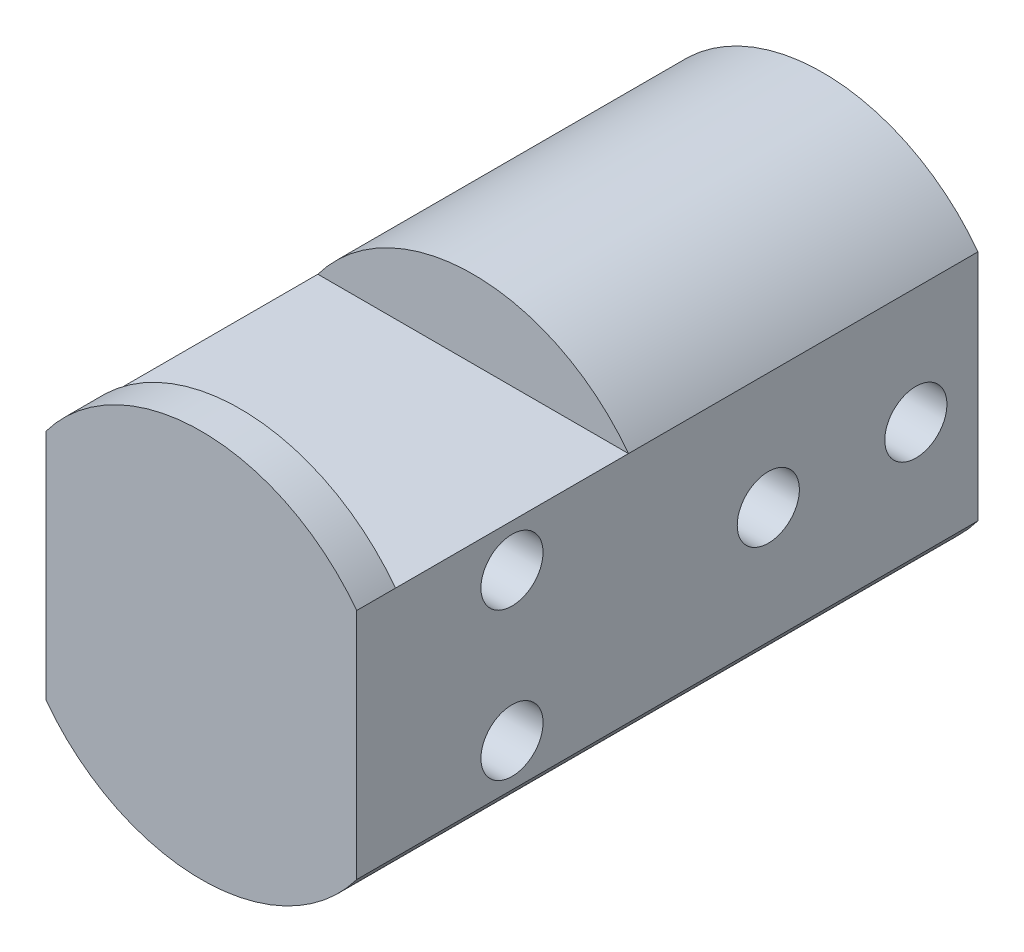
ISO-10303-21;
HEADER;
FILE_DESCRIPTION(('STEP AP214'),'2;1');
FILE_NAME('part.step','',(''),(''),'','','');
FILE_SCHEMA(('AUTOMOTIVE_DESIGN { 1 0 10303 214 1 1 1 1 }'));
ENDSEC;
DATA;
#1=APPLICATION_CONTEXT('core data for automotive mechanical design processes');
#2=APPLICATION_PROTOCOL_DEFINITION('international standard','automotive_design',2000,#1);
#3=PRODUCT_CONTEXT('',#1,'mechanical');
#4=PRODUCT('Part','Part','',(#3));
#5=PRODUCT_RELATED_PRODUCT_CATEGORY('part','',(#4));
#6=PRODUCT_DEFINITION_FORMATION('','',#4);
#7=PRODUCT_DEFINITION_CONTEXT('part definition',#1,'design');
#8=PRODUCT_DEFINITION('design','',#6,#7);
#9=PRODUCT_DEFINITION_SHAPE('','',#8);
#10=(LENGTH_UNIT() NAMED_UNIT(*) SI_UNIT(.MILLI.,.METRE.));
#11=(NAMED_UNIT(*) PLANE_ANGLE_UNIT() SI_UNIT($,.RADIAN.));
#12=(NAMED_UNIT(*) SI_UNIT($,.STERADIAN.) SOLID_ANGLE_UNIT());
#13=UNCERTAINTY_MEASURE_WITH_UNIT(LENGTH_MEASURE(1.E-05),#10,'distance_accuracy_value','');
#14=(GEOMETRIC_REPRESENTATION_CONTEXT(3) GLOBAL_UNCERTAINTY_ASSIGNED_CONTEXT((#13)) GLOBAL_UNIT_ASSIGNED_CONTEXT((#10,
#11,#12)) REPRESENTATION_CONTEXT('',''));
#15=CARTESIAN_POINT('',(0.,0.,0.));
#16=DIRECTION('',(0.,0.,1.));
#17=DIRECTION('',(1.,0.,0.));
#18=AXIS2_PLACEMENT_3D('',#15,#16,#17);
#19=CARTESIAN_POINT('',(-20.,15.,45.));
#20=DIRECTION('',(0.,-1.,0.));
#21=DIRECTION('',(0.,0.,-1.));
#22=AXIS2_PLACEMENT_3D('',#19,#20,#21);
#23=PLANE('',#22);
#24=DIRECTION('',(1.,0.,0.));
#25=VECTOR('',#24,1.);
#26=CARTESIAN_POINT('',(-20.,15.,75.));
#27=LINE('',#26,#25);
#28=CARTESIAN_POINT('',(-20.,15.,75.));
#29=VERTEX_POINT('',#28);
#30=CARTESIAN_POINT('',(20.,15.,75.));
#31=VERTEX_POINT('',#30);
#32=EDGE_CURVE('E57',#29,#31,#27,.T.);
#33=ORIENTED_EDGE('',*,*,#32,.T.);
#34=DIRECTION('',(0.,0.,-1.));
#35=VECTOR('',#34,1.);
#36=CARTESIAN_POINT('',(20.,15.,80.));
#37=LINE('',#36,#35);
#38=CARTESIAN_POINT('',(20.,15.,45.));
#39=VERTEX_POINT('',#38);
#40=EDGE_CURVE('E154',#31,#39,#37,.T.);
#41=ORIENTED_EDGE('',*,*,#40,.T.);
#42=DIRECTION('',(1.,0.,0.));
#43=VECTOR('',#42,1.);
#44=CARTESIAN_POINT('',(-20.,15.,45.));
#45=LINE('',#44,#43);
#46=CARTESIAN_POINT('',(-20.,15.,45.));
#47=VERTEX_POINT('',#46);
#48=EDGE_CURVE('E172',#47,#39,#45,.T.);
#49=ORIENTED_EDGE('',*,*,#48,.F.);
#50=DIRECTION('',(0.,0.,-1.));
#51=VECTOR('',#50,1.);
#52=CARTESIAN_POINT('',(-20.,15.,80.));
#53=LINE('',#52,#51);
#54=EDGE_CURVE('E52',#29,#47,#53,.T.);
#55=ORIENTED_EDGE('',*,*,#54,.F.);
#56=EDGE_LOOP('',(#33,#41,#49,#55));
#57=FACE_BOUND('',#56,.T.);
#58=ADVANCED_FACE('F37',(#57),#23,.F.);
#59=CARTESIAN_POINT('',(0.,0.,80.));
#60=DIRECTION('',(0.,0.,-1.));
#61=DIRECTION('',(-1.,0.,0.));
#62=AXIS2_PLACEMENT_3D('',#59,#60,#61);
#63=CYLINDRICAL_SURFACE('',#62,25.);
#64=CARTESIAN_POINT('',(0.,0.,45.));
#65=DIRECTION('',(0.,0.,1.));
#66=DIRECTION('',(1.,0.,0.));
#67=AXIS2_PLACEMENT_3D('',#64,#65,#66);
#68=CIRCLE('',#67,25.);
#69=EDGE_CURVE('E169',#39,#47,#68,.T.);
#70=ORIENTED_EDGE('',*,*,#69,.F.);
#71=CARTESIAN_POINT('',(20.,15.,0.));
#72=VERTEX_POINT('',#71);
#73=EDGE_CURVE('E160',#39,#72,#37,.T.);
#74=ORIENTED_EDGE('',*,*,#73,.T.);
#75=CARTESIAN_POINT('',(0.,0.,0.));
#76=DIRECTION('',(0.,0.,1.));
#77=DIRECTION('',(1.,0.,0.));
#78=AXIS2_PLACEMENT_3D('',#75,#76,#77);
#79=CIRCLE('',#78,25.);
#80=CARTESIAN_POINT('',(-20.,15.,0.));
#81=VERTEX_POINT('',#80);
#82=EDGE_CURVE('E237',#72,#81,#79,.T.);
#83=ORIENTED_EDGE('',*,*,#82,.T.);
#84=EDGE_CURVE('E246',#47,#81,#53,.T.);
#85=ORIENTED_EDGE('',*,*,#84,.F.);
#86=EDGE_LOOP('',(#70,#74,#83,#85));
#87=FACE_BOUND('',#86,.T.);
#88=ADVANCED_FACE('F335',(#87),#63,.T.);
#89=CARTESIAN_POINT('',(20.,0.,80.));
#90=DIRECTION('',(1.,0.,0.));
#91=DIRECTION('',(0.,0.,-1.));
#92=AXIS2_PLACEMENT_3D('',#89,#90,#91);
#93=PLANE('',#92);
#94=CARTESIAN_POINT('',(20.,-9.5,60.));
#95=DIRECTION('',(-1.,0.,0.));
#96=DIRECTION('',(0.,0.,1.));
#97=AXIS2_PLACEMENT_3D('',#94,#95,#96);
#98=CIRCLE('',#97,4.00000000000001);
#99=CARTESIAN_POINT('',(20.,-9.5,64.));
#100=VERTEX_POINT('',#99);
#101=EDGE_CURVE('E176',#100,#100,#98,.T.);
#102=ORIENTED_EDGE('',*,*,#101,.T.);
#103=EDGE_LOOP('',(#102));
#104=FACE_BOUND('',#103,.T.);
#105=CARTESIAN_POINT('',(20.,9.5,60.));
#106=DIRECTION('',(-1.,0.,0.));
#107=DIRECTION('',(0.,0.,1.));
#108=AXIS2_PLACEMENT_3D('',#105,#106,#107);
#109=CIRCLE('',#108,4.00000000000001);
#110=CARTESIAN_POINT('',(20.,9.5,64.));
#111=VERTEX_POINT('',#110);
#112=EDGE_CURVE('E182',#111,#111,#109,.T.);
#113=ORIENTED_EDGE('',*,*,#112,.T.);
#114=EDGE_LOOP('',(#113));
#115=FACE_BOUND('',#114,.T.);
#116=CARTESIAN_POINT('',(20.,0.,27.));
#117=DIRECTION('',(-1.,0.,0.));
#118=DIRECTION('',(0.,0.,1.));
#119=AXIS2_PLACEMENT_3D('',#116,#117,#118);
#120=CIRCLE('',#119,4.);
#121=CARTESIAN_POINT('',(20.,0.,31.));
#122=VERTEX_POINT('',#121);
#123=EDGE_CURVE('E188',#122,#122,#120,.T.);
#124=ORIENTED_EDGE('',*,*,#123,.T.);
#125=EDGE_LOOP('',(#124));
#126=FACE_BOUND('',#125,.T.);
#127=CARTESIAN_POINT('',(20.,0.,8.));
#128=DIRECTION('',(-1.,0.,0.));
#129=DIRECTION('',(0.,0.,1.));
#130=AXIS2_PLACEMENT_3D('',#127,#128,#129);
#131=CIRCLE('',#130,4.);
#132=CARTESIAN_POINT('',(20.,0.,12.));
#133=VERTEX_POINT('',#132);
#134=EDGE_CURVE('E198',#133,#133,#131,.T.);
#135=ORIENTED_EDGE('',*,*,#134,.T.);
#136=EDGE_LOOP('',(#135));
#137=FACE_BOUND('',#136,.T.);
#138=DIRECTION('',(0.,-1.,0.));
#139=VECTOR('',#138,1.);
#140=CARTESIAN_POINT('',(20.,0.,0.));
#141=LINE('',#140,#139);
#142=CARTESIAN_POINT('',(20.,-15.,0.));
#143=VERTEX_POINT('',#142);
#144=EDGE_CURVE('E221',#72,#143,#141,.T.);
#145=ORIENTED_EDGE('',*,*,#144,.F.);
#146=ORIENTED_EDGE('',*,*,#73,.F.);
#147=ORIENTED_EDGE('',*,*,#40,.F.);
#148=CARTESIAN_POINT('',(20.,15.,80.));
#149=VERTEX_POINT('',#148);
#150=EDGE_CURVE('E150',#149,#31,#37,.T.);
#151=ORIENTED_EDGE('',*,*,#150,.F.);
#152=DIRECTION('',(0.,-1.,0.));
#153=VECTOR('',#152,1.);
#154=CARTESIAN_POINT('',(20.,0.,80.));
#155=LINE('',#154,#153);
#156=CARTESIAN_POINT('',(20.,-15.,80.));
#157=VERTEX_POINT('',#156);
#158=EDGE_CURVE('E136',#149,#157,#155,.T.);
#159=ORIENTED_EDGE('',*,*,#158,.T.);
#160=DIRECTION('',(0.,0.,-1.));
#161=VECTOR('',#160,1.);
#162=CARTESIAN_POINT('',(20.,-15.,80.));
#163=LINE('',#162,#161);
#164=EDGE_CURVE('E233',#157,#143,#163,.T.);
#165=ORIENTED_EDGE('',*,*,#164,.T.);
#166=EDGE_LOOP('',(#145,#146,#147,#151,#159,#165));
#167=FACE_BOUND('',#166,.T.);
#168=ADVANCED_FACE('F152',(#104,#115,#126,#137,#167),#93,.T.);
#169=CARTESIAN_POINT('',(-20.,0.,80.));
#170=DIRECTION('',(-1.,0.,0.));
#171=DIRECTION('',(0.,0.,1.));
#172=AXIS2_PLACEMENT_3D('',#169,#170,#171);
#173=PLANE('',#172);
#174=CARTESIAN_POINT('',(-20.,-9.5,60.));
#175=DIRECTION('',(-1.,0.,0.));
#176=DIRECTION('',(0.,0.,1.));
#177=AXIS2_PLACEMENT_3D('',#174,#175,#176);
#178=CIRCLE('',#177,4.00000000000001);
#179=CARTESIAN_POINT('',(-20.,-9.5,64.));
#180=VERTEX_POINT('',#179);
#181=EDGE_CURVE('E175',#180,#180,#178,.T.);
#182=ORIENTED_EDGE('',*,*,#181,.F.);
#183=EDGE_LOOP('',(#182));
#184=FACE_BOUND('',#183,.T.);
#185=CARTESIAN_POINT('',(-20.,9.5,60.));
#186=DIRECTION('',(-1.,0.,0.));
#187=DIRECTION('',(0.,0.,1.));
#188=AXIS2_PLACEMENT_3D('',#185,#186,#187);
#189=CIRCLE('',#188,4.00000000000001);
#190=CARTESIAN_POINT('',(-20.,9.5,64.));
#191=VERTEX_POINT('',#190);
#192=EDGE_CURVE('E179',#191,#191,#189,.T.);
#193=ORIENTED_EDGE('',*,*,#192,.F.);
#194=EDGE_LOOP('',(#193));
#195=FACE_BOUND('',#194,.T.);
#196=CARTESIAN_POINT('',(-20.,0.,27.));
#197=DIRECTION('',(-1.,0.,0.));
#198=DIRECTION('',(0.,0.,1.));
#199=AXIS2_PLACEMENT_3D('',#196,#197,#198);
#200=CIRCLE('',#199,4.);
#201=CARTESIAN_POINT('',(-20.,0.,31.));
#202=VERTEX_POINT('',#201);
#203=EDGE_CURVE('E185',#202,#202,#200,.T.);
#204=ORIENTED_EDGE('',*,*,#203,.F.);
#205=EDGE_LOOP('',(#204));
#206=FACE_BOUND('',#205,.T.);
#207=CARTESIAN_POINT('',(-20.,0.,8.));
#208=DIRECTION('',(-1.,0.,0.));
#209=DIRECTION('',(0.,0.,1.));
#210=AXIS2_PLACEMENT_3D('',#207,#208,#209);
#211=CIRCLE('',#210,4.);
#212=CARTESIAN_POINT('',(-20.,0.,12.));
#213=VERTEX_POINT('',#212);
#214=EDGE_CURVE('E197',#213,#213,#211,.T.);
#215=ORIENTED_EDGE('',*,*,#214,.F.);
#216=EDGE_LOOP('',(#215));
#217=FACE_BOUND('',#216,.T.);
#218=DIRECTION('',(0.,1.,0.));
#219=VECTOR('',#218,1.);
#220=CARTESIAN_POINT('',(-20.,0.,0.));
#221=LINE('',#220,#219);
#222=CARTESIAN_POINT('',(-20.,-15.,0.));
#223=VERTEX_POINT('',#222);
#224=EDGE_CURVE('E240',#223,#81,#221,.T.);
#225=ORIENTED_EDGE('',*,*,#224,.F.);
#226=DIRECTION('',(0.,0.,-1.));
#227=VECTOR('',#226,1.);
#228=CARTESIAN_POINT('',(-20.,-15.,80.));
#229=LINE('',#228,#227);
#230=CARTESIAN_POINT('',(-20.,-15.,80.));
#231=VERTEX_POINT('',#230);
#232=EDGE_CURVE('E244',#231,#223,#229,.T.);
#233=ORIENTED_EDGE('',*,*,#232,.F.);
#234=DIRECTION('',(0.,1.,0.));
#235=VECTOR('',#234,1.);
#236=CARTESIAN_POINT('',(-20.,0.,80.));
#237=LINE('',#236,#235);
#238=CARTESIAN_POINT('',(-20.,15.,80.));
#239=VERTEX_POINT('',#238);
#240=EDGE_CURVE('E146',#231,#239,#237,.T.);
#241=ORIENTED_EDGE('',*,*,#240,.T.);
#242=EDGE_CURVE('E163',#239,#29,#53,.T.);
#243=ORIENTED_EDGE('',*,*,#242,.T.);
#244=ORIENTED_EDGE('',*,*,#54,.T.);
#245=ORIENTED_EDGE('',*,*,#84,.T.);
#246=EDGE_LOOP('',(#225,#233,#241,#243,#244,#245));
#247=FACE_BOUND('',#246,.T.);
#248=ADVANCED_FACE('F379',(#184,#195,#206,#217,#247),#173,.T.);
#249=EDGE_CURVE('E147',#223,#143,#79,.T.);
#250=ORIENTED_EDGE('',*,*,#249,.T.);
#251=ORIENTED_EDGE('',*,*,#164,.F.);
#252=CARTESIAN_POINT('',(0.,0.,80.));
#253=DIRECTION('',(0.,0.,1.));
#254=DIRECTION('',(1.,0.,0.));
#255=AXIS2_PLACEMENT_3D('',#252,#253,#254);
#256=CIRCLE('',#255,25.);
#257=EDGE_CURVE('E143',#231,#157,#256,.T.);
#258=ORIENTED_EDGE('',*,*,#257,.F.);
#259=ORIENTED_EDGE('',*,*,#232,.T.);
#260=EDGE_LOOP('',(#250,#251,#258,#259));
#261=FACE_BOUND('',#260,.T.);
#262=ADVANCED_FACE('F342',(#261),#63,.T.);
#263=CARTESIAN_POINT('',(0.,0.,80.));
#264=DIRECTION('',(0.,0.,1.));
#265=DIRECTION('',(1.,0.,0.));
#266=AXIS2_PLACEMENT_3D('',#263,#264,#265);
#267=PLANE('',#266);
#268=ORIENTED_EDGE('',*,*,#158,.F.);
#269=CARTESIAN_POINT('',(0.,0.,80.));
#270=DIRECTION('',(0.,0.,1.));
#271=DIRECTION('',(1.,0.,0.));
#272=AXIS2_PLACEMENT_3D('',#269,#270,#271);
#273=CIRCLE('',#272,25.);
#274=EDGE_CURVE('E141',#149,#239,#273,.T.);
#275=ORIENTED_EDGE('',*,*,#274,.T.);
#276=ORIENTED_EDGE('',*,*,#240,.F.);
#277=ORIENTED_EDGE('',*,*,#257,.T.);
#278=EDGE_LOOP('',(#268,#275,#276,#277));
#279=FACE_BOUND('',#278,.T.);
#280=ADVANCED_FACE('F138',(#279),#267,.T.);
#281=CARTESIAN_POINT('',(0.,0.,0.));
#282=DIRECTION('',(0.,0.,1.));
#283=DIRECTION('',(1.,0.,0.));
#284=AXIS2_PLACEMENT_3D('',#281,#282,#283);
#285=PLANE('',#284);
#286=DIRECTION('',(-1.,0.,0.));
#287=VECTOR('',#286,1.);
#288=CARTESIAN_POINT('',(-7.5,-7.5,0.));
#289=LINE('',#288,#287);
#290=CARTESIAN_POINT('',(6.5,-7.5,0.));
#291=VERTEX_POINT('',#290);
#292=CARTESIAN_POINT('',(-6.5,-7.5,0.));
#293=VERTEX_POINT('',#292);
#294=EDGE_CURVE('E224',#291,#293,#289,.T.);
#295=ORIENTED_EDGE('',*,*,#294,.F.);
#296=CARTESIAN_POINT('',(6.5,-6.5,0.));
#297=DIRECTION('',(0.,0.,1.));
#298=DIRECTION('',(1.,0.,0.));
#299=AXIS2_PLACEMENT_3D('',#296,#297,#298);
#300=CIRCLE('',#299,1.);
#301=CARTESIAN_POINT('',(7.5,-6.5,0.));
#302=VERTEX_POINT('',#301);
#303=EDGE_CURVE('E281',#291,#302,#300,.T.);
#304=ORIENTED_EDGE('',*,*,#303,.T.);
#305=DIRECTION('',(0.,-1.,0.));
#306=VECTOR('',#305,1.);
#307=CARTESIAN_POINT('',(7.5,-7.5,0.));
#308=LINE('',#307,#306);
#309=CARTESIAN_POINT('',(7.5,6.5,0.));
#310=VERTEX_POINT('',#309);
#311=EDGE_CURVE('E207',#310,#302,#308,.T.);
#312=ORIENTED_EDGE('',*,*,#311,.F.);
#313=CARTESIAN_POINT('',(6.5,6.5,0.));
#314=DIRECTION('',(0.,0.,1.));
#315=DIRECTION('',(1.,0.,0.));
#316=AXIS2_PLACEMENT_3D('',#313,#314,#315);
#317=CIRCLE('',#316,1.);
#318=CARTESIAN_POINT('',(6.5,7.5,0.));
#319=VERTEX_POINT('',#318);
#320=EDGE_CURVE('E11',#310,#319,#317,.T.);
#321=ORIENTED_EDGE('',*,*,#320,.T.);
#322=DIRECTION('',(1.,0.,0.));
#323=VECTOR('',#322,1.);
#324=CARTESIAN_POINT('',(-7.5,7.5,0.));
#325=LINE('',#324,#323);
#326=CARTESIAN_POINT('',(-6.5,7.5,0.));
#327=VERTEX_POINT('',#326);
#328=EDGE_CURVE('E212',#327,#319,#325,.T.);
#329=ORIENTED_EDGE('',*,*,#328,.F.);
#330=CARTESIAN_POINT('',(-6.5,6.5,0.));
#331=DIRECTION('',(0.,0.,1.));
#332=DIRECTION('',(1.,0.,0.));
#333=AXIS2_PLACEMENT_3D('',#330,#331,#332);
#334=CIRCLE('',#333,1.);
#335=CARTESIAN_POINT('',(-7.5,6.5,0.));
#336=VERTEX_POINT('',#335);
#337=EDGE_CURVE('E45',#327,#336,#334,.T.);
#338=ORIENTED_EDGE('',*,*,#337,.T.);
#339=DIRECTION('',(0.,1.,0.));
#340=VECTOR('',#339,1.);
#341=CARTESIAN_POINT('',(-7.5,-7.5,0.));
#342=LINE('',#341,#340);
#343=CARTESIAN_POINT('',(-7.5,-6.5,0.));
#344=VERTEX_POINT('',#343);
#345=EDGE_CURVE('E227',#344,#336,#342,.T.);
#346=ORIENTED_EDGE('',*,*,#345,.F.);
#347=CARTESIAN_POINT('',(-6.5,-6.5,0.));
#348=DIRECTION('',(0.,0.,1.));
#349=DIRECTION('',(1.,0.,0.));
#350=AXIS2_PLACEMENT_3D('',#347,#348,#349);
#351=CIRCLE('',#350,1.);
#352=EDGE_CURVE('E279',#344,#293,#351,.T.);
#353=ORIENTED_EDGE('',*,*,#352,.T.);
#354=EDGE_LOOP('',(#295,#304,#312,#321,#329,#338,#346,#353));
#355=FACE_BOUND('',#354,.T.);
#356=ORIENTED_EDGE('',*,*,#144,.T.);
#357=ORIENTED_EDGE('',*,*,#249,.F.);
#358=ORIENTED_EDGE('',*,*,#224,.T.);
#359=ORIENTED_EDGE('',*,*,#82,.F.);
#360=EDGE_LOOP('',(#356,#357,#358,#359));
#361=FACE_BOUND('',#360,.T.);
#362=ADVANCED_FACE('F286',(#355,#361),#285,.F.);
#363=CARTESIAN_POINT('',(7.5,-7.5,35.));
#364=DIRECTION('',(1.,0.,0.));
#365=DIRECTION('',(0.,0.,-1.));
#366=AXIS2_PLACEMENT_3D('',#363,#364,#365);
#367=PLANE('',#366);
#368=CARTESIAN_POINT('',(7.5,0.,27.));
#369=DIRECTION('',(1.,0.,0.));
#370=DIRECTION('',(0.,0.,-1.));
#371=AXIS2_PLACEMENT_3D('',#368,#369,#370);
#372=CIRCLE('',#371,4.);
#373=CARTESIAN_POINT('',(7.5,0.,23.));
#374=VERTEX_POINT('',#373);
#375=EDGE_CURVE('E194',#374,#374,#372,.T.);
#376=ORIENTED_EDGE('',*,*,#375,.T.);
#377=EDGE_LOOP('',(#376));
#378=FACE_BOUND('',#377,.T.);
#379=CARTESIAN_POINT('',(7.5,0.,8.));
#380=DIRECTION('',(1.,0.,0.));
#381=DIRECTION('',(0.,0.,-1.));
#382=AXIS2_PLACEMENT_3D('',#379,#380,#381);
#383=CIRCLE('',#382,4.);
#384=CARTESIAN_POINT('',(7.5,0.,4.));
#385=VERTEX_POINT('',#384);
#386=EDGE_CURVE('E204',#385,#385,#383,.T.);
#387=ORIENTED_EDGE('',*,*,#386,.T.);
#388=EDGE_LOOP('',(#387));
#389=FACE_BOUND('',#388,.T.);
#390=ORIENTED_EDGE('',*,*,#311,.T.);
#391=DIRECTION('',(0.,0.,-1.));
#392=VECTOR('',#391,1.);
#393=CARTESIAN_POINT('',(7.5,-6.5,35.));
#394=LINE('',#393,#392);
#395=CARTESIAN_POINT('',(7.5,-6.5,35.));
#396=VERTEX_POINT('',#395);
#397=EDGE_CURVE('E272',#302,#396,#394,.F.);
#398=ORIENTED_EDGE('',*,*,#397,.T.);
#399=DIRECTION('',(0.,-1.,0.));
#400=VECTOR('',#399,1.);
#401=CARTESIAN_POINT('',(7.5,-7.5,35.));
#402=LINE('',#401,#400);
#403=CARTESIAN_POINT('',(7.5,6.5,35.));
#404=VERTEX_POINT('',#403);
#405=EDGE_CURVE('E208',#404,#396,#402,.T.);
#406=ORIENTED_EDGE('',*,*,#405,.F.);
#407=DIRECTION('',(0.,0.,-1.));
#408=VECTOR('',#407,1.);
#409=CARTESIAN_POINT('',(7.5,6.5,0.));
#410=LINE('',#409,#408);
#411=EDGE_CURVE('E269',#404,#310,#410,.T.);
#412=ORIENTED_EDGE('',*,*,#411,.T.);
#413=EDGE_LOOP('',(#390,#398,#406,#412));
#414=FACE_BOUND('',#413,.T.);
#415=ADVANCED_FACE('F309',(#378,#389,#414),#367,.F.);
#416=CARTESIAN_POINT('',(-7.5,7.5,35.));
#417=DIRECTION('',(0.,1.,0.));
#418=DIRECTION('',(-1.,0.,0.));
#419=AXIS2_PLACEMENT_3D('',#416,#417,#418);
#420=PLANE('',#419);
#421=DIRECTION('',(1.,0.,0.));
#422=VECTOR('',#421,1.);
#423=CARTESIAN_POINT('',(-7.5,7.5,35.));
#424=LINE('',#423,#422);
#425=CARTESIAN_POINT('',(-6.5,7.5,35.));
#426=VERTEX_POINT('',#425);
#427=CARTESIAN_POINT('',(6.5,7.5,35.));
#428=VERTEX_POINT('',#427);
#429=EDGE_CURVE('E218',#426,#428,#424,.T.);
#430=ORIENTED_EDGE('',*,*,#429,.F.);
#431=DIRECTION('',(0.,0.,-1.));
#432=VECTOR('',#431,1.);
#433=CARTESIAN_POINT('',(-6.5,7.5,0.));
#434=LINE('',#433,#432);
#435=EDGE_CURVE('E276',#426,#327,#434,.T.);
#436=ORIENTED_EDGE('',*,*,#435,.T.);
#437=ORIENTED_EDGE('',*,*,#328,.T.);
#438=DIRECTION('',(0.,0.,-1.));
#439=VECTOR('',#438,1.);
#440=CARTESIAN_POINT('',(6.5,7.5,35.));
#441=LINE('',#440,#439);
#442=EDGE_CURVE('E274',#319,#428,#441,.F.);
#443=ORIENTED_EDGE('',*,*,#442,.T.);
#444=EDGE_LOOP('',(#430,#436,#437,#443));
#445=FACE_BOUND('',#444,.T.);
#446=ADVANCED_FACE('F302',(#445),#420,.F.);
#447=CARTESIAN_POINT('',(-7.5,-7.5,35.));
#448=DIRECTION('',(-1.,0.,0.));
#449=DIRECTION('',(0.,0.,1.));
#450=AXIS2_PLACEMENT_3D('',#447,#448,#449);
#451=PLANE('',#450);
#452=CARTESIAN_POINT('',(-7.5,0.,27.));
#453=DIRECTION('',(-1.,0.,0.));
#454=DIRECTION('',(0.,0.,1.));
#455=AXIS2_PLACEMENT_3D('',#452,#453,#454);
#456=CIRCLE('',#455,4.);
#457=CARTESIAN_POINT('',(-7.5,0.,31.));
#458=VERTEX_POINT('',#457);
#459=EDGE_CURVE('E191',#458,#458,#456,.T.);
#460=ORIENTED_EDGE('',*,*,#459,.T.);
#461=EDGE_LOOP('',(#460));
#462=FACE_BOUND('',#461,.T.);
#463=CARTESIAN_POINT('',(-7.5,0.,8.));
#464=DIRECTION('',(-1.,0.,0.));
#465=DIRECTION('',(0.,0.,1.));
#466=AXIS2_PLACEMENT_3D('',#463,#464,#465);
#467=CIRCLE('',#466,4.);
#468=CARTESIAN_POINT('',(-7.5,0.,12.));
#469=VERTEX_POINT('',#468);
#470=EDGE_CURVE('E201',#469,#469,#467,.T.);
#471=ORIENTED_EDGE('',*,*,#470,.T.);
#472=EDGE_LOOP('',(#471));
#473=FACE_BOUND('',#472,.T.);
#474=DIRECTION('',(0.,1.,0.));
#475=VECTOR('',#474,1.);
#476=CARTESIAN_POINT('',(-7.5,-7.5,35.));
#477=LINE('',#476,#475);
#478=CARTESIAN_POINT('',(-7.5,-6.5,35.));
#479=VERTEX_POINT('',#478);
#480=CARTESIAN_POINT('',(-7.5,6.5,35.));
#481=VERTEX_POINT('',#480);
#482=EDGE_CURVE('E215',#479,#481,#477,.T.);
#483=ORIENTED_EDGE('',*,*,#482,.F.);
#484=DIRECTION('',(0.,0.,-1.));
#485=VECTOR('',#484,1.);
#486=CARTESIAN_POINT('',(-7.5,-6.5,0.));
#487=LINE('',#486,#485);
#488=EDGE_CURVE('E253',#479,#344,#487,.T.);
#489=ORIENTED_EDGE('',*,*,#488,.T.);
#490=ORIENTED_EDGE('',*,*,#345,.T.);
#491=DIRECTION('',(0.,0.,-1.));
#492=VECTOR('',#491,1.);
#493=CARTESIAN_POINT('',(-7.5,6.5,35.));
#494=LINE('',#493,#492);
#495=EDGE_CURVE('E158',#336,#481,#494,.F.);
#496=ORIENTED_EDGE('',*,*,#495,.T.);
#497=EDGE_LOOP('',(#483,#489,#490,#496));
#498=FACE_BOUND('',#497,.T.);
#499=ADVANCED_FACE('F293',(#462,#473,#498),#451,.F.);
#500=CARTESIAN_POINT('',(-7.5,-7.5,35.));
#501=DIRECTION('',(0.,-1.,0.));
#502=DIRECTION('',(0.,0.,-1.));
#503=AXIS2_PLACEMENT_3D('',#500,#501,#502);
#504=PLANE('',#503);
#505=ORIENTED_EDGE('',*,*,#294,.T.);
#506=DIRECTION('',(0.,0.,-1.));
#507=VECTOR('',#506,1.);
#508=CARTESIAN_POINT('',(-6.5,-7.5,35.));
#509=LINE('',#508,#507);
#510=CARTESIAN_POINT('',(-6.5,-7.5,35.));
#511=VERTEX_POINT('',#510);
#512=EDGE_CURVE('E259',#293,#511,#509,.F.);
#513=ORIENTED_EDGE('',*,*,#512,.T.);
#514=DIRECTION('',(-1.,0.,0.));
#515=VECTOR('',#514,1.);
#516=CARTESIAN_POINT('',(-7.5,-7.5,35.));
#517=LINE('',#516,#515);
#518=CARTESIAN_POINT('',(6.5,-7.5,35.));
#519=VERTEX_POINT('',#518);
#520=EDGE_CURVE('E211',#519,#511,#517,.T.);
#521=ORIENTED_EDGE('',*,*,#520,.F.);
#522=DIRECTION('',(0.,0.,-1.));
#523=VECTOR('',#522,1.);
#524=CARTESIAN_POINT('',(6.5,-7.5,0.));
#525=LINE('',#524,#523);
#526=EDGE_CURVE('E256',#519,#291,#525,.T.);
#527=ORIENTED_EDGE('',*,*,#526,.T.);
#528=EDGE_LOOP('',(#505,#513,#521,#527));
#529=FACE_BOUND('',#528,.T.);
#530=ADVANCED_FACE('F318',(#529),#504,.F.);
#531=CARTESIAN_POINT('',(0.,0.,35.));
#532=DIRECTION('',(0.,0.,-1.));
#533=DIRECTION('',(-1.,0.,0.));
#534=AXIS2_PLACEMENT_3D('',#531,#532,#533);
#535=PLANE('',#534);
#536=ORIENTED_EDGE('',*,*,#520,.T.);
#537=CARTESIAN_POINT('',(-6.5,-6.5,35.));
#538=DIRECTION('',(0.,0.,-1.));
#539=DIRECTION('',(-1.,0.,0.));
#540=AXIS2_PLACEMENT_3D('',#537,#538,#539);
#541=CIRCLE('',#540,1.);
#542=EDGE_CURVE('E267',#511,#479,#541,.T.);
#543=ORIENTED_EDGE('',*,*,#542,.T.);
#544=ORIENTED_EDGE('',*,*,#482,.T.);
#545=CARTESIAN_POINT('',(-6.5,6.5,35.));
#546=DIRECTION('',(0.,0.,-1.));
#547=DIRECTION('',(-1.,0.,0.));
#548=AXIS2_PLACEMENT_3D('',#545,#546,#547);
#549=CIRCLE('',#548,1.);
#550=EDGE_CURVE('E263',#481,#426,#549,.T.);
#551=ORIENTED_EDGE('',*,*,#550,.T.);
#552=ORIENTED_EDGE('',*,*,#429,.T.);
#553=CARTESIAN_POINT('',(6.5,6.5,35.));
#554=DIRECTION('',(0.,0.,-1.));
#555=DIRECTION('',(-1.,0.,0.));
#556=AXIS2_PLACEMENT_3D('',#553,#554,#555);
#557=CIRCLE('',#556,1.);
#558=EDGE_CURVE('E261',#428,#404,#557,.T.);
#559=ORIENTED_EDGE('',*,*,#558,.T.);
#560=ORIENTED_EDGE('',*,*,#405,.T.);
#561=CARTESIAN_POINT('',(6.5,-6.5,35.));
#562=DIRECTION('',(0.,0.,-1.));
#563=DIRECTION('',(-1.,0.,0.));
#564=AXIS2_PLACEMENT_3D('',#561,#562,#563);
#565=CIRCLE('',#564,1.);
#566=EDGE_CURVE('E265',#396,#519,#565,.T.);
#567=ORIENTED_EDGE('',*,*,#566,.T.);
#568=EDGE_LOOP('',(#536,#543,#544,#551,#552,#559,#560,#567));
#569=FACE_BOUND('',#568,.T.);
#570=ADVANCED_FACE('F299',(#569),#535,.T.);
#571=CARTESIAN_POINT('',(20.,0.,8.));
#572=DIRECTION('',(-1.,0.,0.));
#573=DIRECTION('',(0.,0.,1.));
#574=AXIS2_PLACEMENT_3D('',#571,#572,#573);
#575=CYLINDRICAL_SURFACE('',#574,4.);
#576=ORIENTED_EDGE('',*,*,#214,.T.);
#577=EDGE_LOOP('',(#576));
#578=FACE_BOUND('',#577,.T.);
#579=ORIENTED_EDGE('',*,*,#470,.F.);
#580=EDGE_LOOP('',(#579));
#581=FACE_BOUND('',#580,.T.);
#582=ADVANCED_FACE('F360',(#578,#581),#575,.F.);
#583=ORIENTED_EDGE('',*,*,#134,.F.);
#584=EDGE_LOOP('',(#583));
#585=FACE_BOUND('',#584,.T.);
#586=ORIENTED_EDGE('',*,*,#386,.F.);
#587=EDGE_LOOP('',(#586));
#588=FACE_BOUND('',#587,.T.);
#589=ADVANCED_FACE('F357',(#585,#588),#575,.F.);
#590=CARTESIAN_POINT('',(20.,0.,27.));
#591=DIRECTION('',(-1.,0.,0.));
#592=DIRECTION('',(0.,0.,1.));
#593=AXIS2_PLACEMENT_3D('',#590,#591,#592);
#594=CYLINDRICAL_SURFACE('',#593,4.);
#595=ORIENTED_EDGE('',*,*,#203,.T.);
#596=EDGE_LOOP('',(#595));
#597=FACE_BOUND('',#596,.T.);
#598=ORIENTED_EDGE('',*,*,#459,.F.);
#599=EDGE_LOOP('',(#598));
#600=FACE_BOUND('',#599,.T.);
#601=ADVANCED_FACE('F355',(#597,#600),#594,.F.);
#602=ORIENTED_EDGE('',*,*,#123,.F.);
#603=EDGE_LOOP('',(#602));
#604=FACE_BOUND('',#603,.T.);
#605=ORIENTED_EDGE('',*,*,#375,.F.);
#606=EDGE_LOOP('',(#605));
#607=FACE_BOUND('',#606,.T.);
#608=ADVANCED_FACE('F351',(#604,#607),#594,.F.);
#609=CARTESIAN_POINT('',(20.,9.5,60.));
#610=DIRECTION('',(-1.,0.,0.));
#611=DIRECTION('',(0.,0.,1.));
#612=AXIS2_PLACEMENT_3D('',#609,#610,#611);
#613=CYLINDRICAL_SURFACE('',#612,4.00000000000001);
#614=ORIENTED_EDGE('',*,*,#112,.F.);
#615=EDGE_LOOP('',(#614));
#616=FACE_BOUND('',#615,.T.);
#617=ORIENTED_EDGE('',*,*,#192,.T.);
#618=EDGE_LOOP('',(#617));
#619=FACE_BOUND('',#618,.T.);
#620=ADVANCED_FACE('F347',(#616,#619),#613,.F.);
#621=CARTESIAN_POINT('',(20.,-9.5,60.));
#622=DIRECTION('',(-1.,0.,0.));
#623=DIRECTION('',(0.,0.,1.));
#624=AXIS2_PLACEMENT_3D('',#621,#622,#623);
#625=CYLINDRICAL_SURFACE('',#624,4.00000000000001);
#626=ORIENTED_EDGE('',*,*,#101,.F.);
#627=EDGE_LOOP('',(#626));
#628=FACE_BOUND('',#627,.T.);
#629=ORIENTED_EDGE('',*,*,#181,.T.);
#630=EDGE_LOOP('',(#629));
#631=FACE_BOUND('',#630,.T.);
#632=ADVANCED_FACE('F330',(#628,#631),#625,.F.);
#633=CARTESIAN_POINT('',(0.,0.,45.));
#634=DIRECTION('',(0.,0.,1.));
#635=DIRECTION('',(1.,0.,0.));
#636=AXIS2_PLACEMENT_3D('',#633,#634,#635);
#637=PLANE('',#636);
#638=ORIENTED_EDGE('',*,*,#69,.T.);
#639=ORIENTED_EDGE('',*,*,#48,.T.);
#640=EDGE_LOOP('',(#638,#639));
#641=FACE_BOUND('',#640,.T.);
#642=ADVANCED_FACE('F323',(#641),#637,.T.);
#643=CARTESIAN_POINT('',(-6.5,-6.5,35.));
#644=DIRECTION('',(0.,0.,1.));
#645=DIRECTION('',(1.,0.,0.));
#646=AXIS2_PLACEMENT_3D('',#643,#644,#645);
#647=CYLINDRICAL_SURFACE('',#646,1.);
#648=ORIENTED_EDGE('',*,*,#542,.F.);
#649=ORIENTED_EDGE('',*,*,#512,.F.);
#650=ORIENTED_EDGE('',*,*,#352,.F.);
#651=ORIENTED_EDGE('',*,*,#488,.F.);
#652=EDGE_LOOP('',(#648,#649,#650,#651));
#653=FACE_BOUND('',#652,.T.);
#654=ADVANCED_FACE('F321',(#653),#647,.F.);
#655=CARTESIAN_POINT('',(6.5,-6.5,35.));
#656=DIRECTION('',(0.,0.,1.));
#657=DIRECTION('',(1.,0.,0.));
#658=AXIS2_PLACEMENT_3D('',#655,#656,#657);
#659=CYLINDRICAL_SURFACE('',#658,1.);
#660=ORIENTED_EDGE('',*,*,#566,.F.);
#661=ORIENTED_EDGE('',*,*,#397,.F.);
#662=ORIENTED_EDGE('',*,*,#303,.F.);
#663=ORIENTED_EDGE('',*,*,#526,.F.);
#664=EDGE_LOOP('',(#660,#661,#662,#663));
#665=FACE_BOUND('',#664,.T.);
#666=ADVANCED_FACE('F313',(#665),#659,.F.);
#667=CARTESIAN_POINT('',(-6.5,6.5,35.));
#668=DIRECTION('',(0.,0.,1.));
#669=DIRECTION('',(1.,0.,0.));
#670=AXIS2_PLACEMENT_3D('',#667,#668,#669);
#671=CYLINDRICAL_SURFACE('',#670,1.);
#672=ORIENTED_EDGE('',*,*,#550,.F.);
#673=ORIENTED_EDGE('',*,*,#495,.F.);
#674=ORIENTED_EDGE('',*,*,#337,.F.);
#675=ORIENTED_EDGE('',*,*,#435,.F.);
#676=EDGE_LOOP('',(#672,#673,#674,#675));
#677=FACE_BOUND('',#676,.T.);
#678=ADVANCED_FACE('F296',(#677),#671,.F.);
#679=CARTESIAN_POINT('',(6.5,6.5,35.));
#680=DIRECTION('',(0.,0.,1.));
#681=DIRECTION('',(1.,0.,0.));
#682=AXIS2_PLACEMENT_3D('',#679,#680,#681);
#683=CYLINDRICAL_SURFACE('',#682,1.);
#684=ORIENTED_EDGE('',*,*,#558,.F.);
#685=ORIENTED_EDGE('',*,*,#442,.F.);
#686=ORIENTED_EDGE('',*,*,#320,.F.);
#687=ORIENTED_EDGE('',*,*,#411,.F.);
#688=EDGE_LOOP('',(#684,#685,#686,#687));
#689=FACE_BOUND('',#688,.T.);
#690=ADVANCED_FACE('F39',(#689),#683,.F.);
#691=CARTESIAN_POINT('',(0.,0.,75.));
#692=DIRECTION('',(0.,0.,1.));
#693=DIRECTION('',(1.,0.,0.));
#694=AXIS2_PLACEMENT_3D('',#691,#692,#693);
#695=CYLINDRICAL_SURFACE('',#694,25.);
#696=ORIENTED_EDGE('',*,*,#274,.F.);
#697=ORIENTED_EDGE('',*,*,#150,.T.);
#698=CARTESIAN_POINT('',(0.,0.,75.));
#699=DIRECTION('',(0.,0.,1.));
#700=DIRECTION('',(1.,0.,0.));
#701=AXIS2_PLACEMENT_3D('',#698,#699,#700);
#702=CIRCLE('',#701,25.);
#703=EDGE_CURVE('E164',#31,#29,#702,.T.);
#704=ORIENTED_EDGE('',*,*,#703,.T.);
#705=ORIENTED_EDGE('',*,*,#242,.F.);
#706=EDGE_LOOP('',(#696,#697,#704,#705));
#707=FACE_BOUND('',#706,.T.);
#708=ADVANCED_FACE('F162',(#707),#695,.T.);
#709=CARTESIAN_POINT('',(0.,0.,75.));
#710=DIRECTION('',(0.,0.,1.));
#711=DIRECTION('',(1.,0.,0.));
#712=AXIS2_PLACEMENT_3D('',#709,#710,#711);
#713=PLANE('',#712);
#714=ORIENTED_EDGE('',*,*,#703,.F.);
#715=ORIENTED_EDGE('',*,*,#32,.F.);
#716=EDGE_LOOP('',(#714,#715));
#717=FACE_BOUND('',#716,.T.);
#718=ADVANCED_FACE('F413',(#717),#713,.F.);
#719=CLOSED_SHELL('',(#58,#88,#168,#248,#262,#280,#362,#415,#446,#499,#530,#570,#582,#589,#601,
#608,#620,#632,#642,#654,#666,#678,#690,#708,#718));
#720=MANIFOLD_SOLID_BREP('B2',#719);
#721=ADVANCED_BREP_SHAPE_REPRESENTATION('',(#18,#720),#14);
#722=SHAPE_DEFINITION_REPRESENTATION(#9,#721);
ENDSEC;
END-ISO-10303-21;
